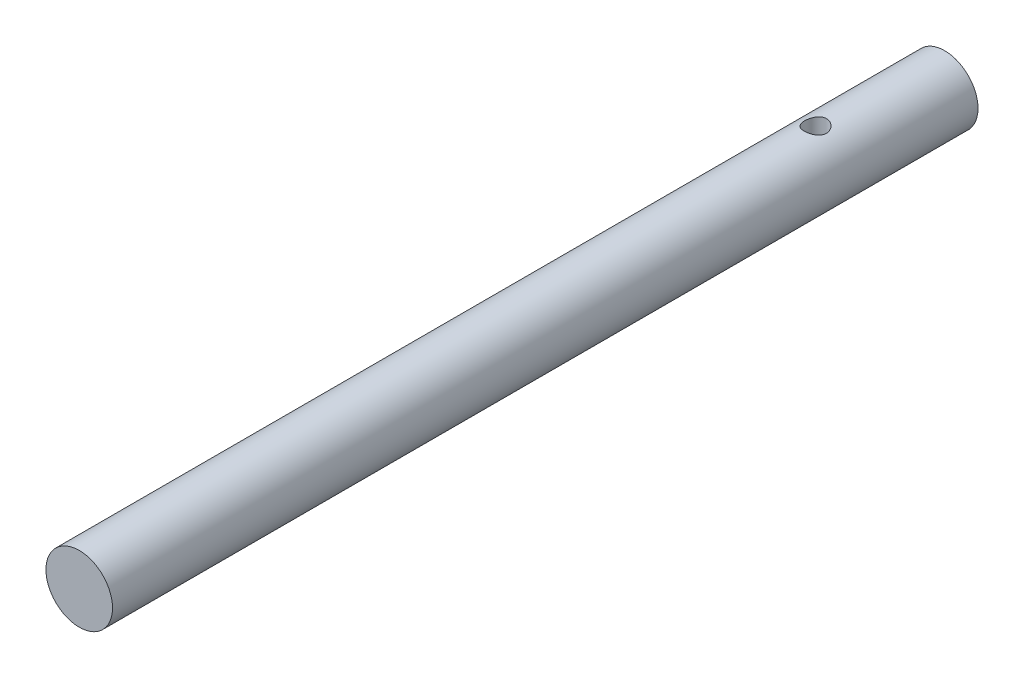
ISO-10303-21;
HEADER;
FILE_DESCRIPTION(('STEP AP214'),'2;1');
FILE_NAME('part.step','',(''),(''),'','','');
FILE_SCHEMA(('AUTOMOTIVE_DESIGN { 1 0 10303 214 1 1 1 1 }'));
ENDSEC;
DATA;
#1=APPLICATION_CONTEXT('core data for automotive mechanical design processes');
#2=APPLICATION_PROTOCOL_DEFINITION('international standard','automotive_design',2000,#1);
#3=PRODUCT_CONTEXT('',#1,'mechanical');
#4=PRODUCT('Part','Part','',(#3));
#5=PRODUCT_RELATED_PRODUCT_CATEGORY('part','',(#4));
#6=PRODUCT_DEFINITION_FORMATION('','',#4);
#7=PRODUCT_DEFINITION_CONTEXT('part definition',#1,'design');
#8=PRODUCT_DEFINITION('design','',#6,#7);
#9=PRODUCT_DEFINITION_SHAPE('','',#8);
#10=(LENGTH_UNIT() NAMED_UNIT(*) SI_UNIT(.MILLI.,.METRE.));
#11=(NAMED_UNIT(*) PLANE_ANGLE_UNIT() SI_UNIT($,.RADIAN.));
#12=(NAMED_UNIT(*) SI_UNIT($,.STERADIAN.) SOLID_ANGLE_UNIT());
#13=UNCERTAINTY_MEASURE_WITH_UNIT(LENGTH_MEASURE(1.E-05),#10,'distance_accuracy_value','');
#14=(GEOMETRIC_REPRESENTATION_CONTEXT(3) GLOBAL_UNCERTAINTY_ASSIGNED_CONTEXT((#13)) GLOBAL_UNIT_ASSIGNED_CONTEXT((#10,
#11,#12)) REPRESENTATION_CONTEXT('',''));
#15=CARTESIAN_POINT('',(0.,0.,0.));
#16=DIRECTION('',(0.,0.,1.));
#17=DIRECTION('',(1.,0.,0.));
#18=AXIS2_PLACEMENT_3D('',#15,#16,#17);
#19=CARTESIAN_POINT('',(0.,0.,130.));
#20=DIRECTION('',(0.,0.,-1.));
#21=DIRECTION('',(-1.,0.,0.));
#22=AXIS2_PLACEMENT_3D('',#19,#20,#21);
#23=CYLINDRICAL_SURFACE('',#22,5.);
#24=CARTESIAN_POINT('',(-1.69715960382936,4.70315312095298,19.3649167310371));
#25=CARTESIAN_POINT('',(-1.69715984603197,4.70315297962643,19.2749873317465));
#26=CARTESIAN_POINT('',(-1.68980901796196,4.70582509056349,19.1850590445374));
#27=CARTESIAN_POINT('',(-1.66069430554536,4.71617721664963,19.0078630576019));
#28=CARTESIAN_POINT('',(-1.63892780631591,4.7238581403518,18.9205958435767));
#29=CARTESIAN_POINT('',(-1.58182016172597,4.74328411922453,18.751317031658));
#30=CARTESIAN_POINT('',(-1.54650519132117,4.75502133353801,18.6692956533736));
#31=CARTESIAN_POINT('',(-1.46338266704602,4.78125545978098,18.51233523468));
#32=CARTESIAN_POINT('',(-1.41557244326298,4.79575296133255,18.4373977125734));
#33=CARTESIAN_POINT('',(-1.30684156370127,4.82653705632037,18.2938590916488));
#34=CARTESIAN_POINT('',(-1.24552257124465,4.84286835260061,18.2255692453036));
#35=CARTESIAN_POINT('',(-1.11234941693013,4.87517876014623,18.1000574633582));
#36=CARTESIAN_POINT('',(-1.04049360401515,4.89115781576539,18.0428372655711));
#37=CARTESIAN_POINT('',(-0.88600882690853,4.92151724276404,17.9396831420143));
#38=CARTESIAN_POINT('',(-0.803151771025416,4.93584642315683,17.8940744246304));
#39=CARTESIAN_POINT('',(-0.630385366806284,4.96086875329516,17.8175879961873));
#40=CARTESIAN_POINT('',(-0.540477886214641,4.97156286203815,17.7867063989805));
#41=CARTESIAN_POINT('',(-0.359414149270377,4.98786505369194,17.7416036591619));
#42=CARTESIAN_POINT('',(-0.268405421609514,4.99363437087109,17.7268495160485));
#43=CARTESIAN_POINT('',(-0.0850332261184434,5.00011773364319,17.7127267323223));
#44=CARTESIAN_POINT('',(0.00732989341670704,5.00083305684216,17.713354203191));
#45=CARTESIAN_POINT('',(0.18701876385454,4.9972787774664,17.7296367055802));
#46=CARTESIAN_POINT('',(0.274401651198524,4.99319978898323,17.7447129959743));
#47=CARTESIAN_POINT('',(0.445361651463065,4.98086361514448,17.7885093342228));
#48=CARTESIAN_POINT('',(0.528938507403767,4.97260614811631,17.8172303018613));
#49=CARTESIAN_POINT('',(0.6911855900331,4.95267966483971,17.8878441091013));
#50=CARTESIAN_POINT('',(0.769777856989786,4.94096767181081,17.9299034152945));
#51=CARTESIAN_POINT('',(0.918984384417156,4.91540499247986,18.0258634060757));
#52=CARTESIAN_POINT('',(0.98959644981253,4.90155372020417,18.0797673367604));
#53=CARTESIAN_POINT('',(1.12427876274281,4.87247010159022,18.2008119075043));
#54=CARTESIAN_POINT('',(1.18789604850819,4.85720351424252,18.2684490367714));
#55=CARTESIAN_POINT('',(1.30302212732983,4.82759522626236,18.4135433206727));
#56=CARTESIAN_POINT('',(1.35452913078509,4.81325366255253,18.4910019240782));
#57=CARTESIAN_POINT('',(1.44457227708496,4.78700841574361,18.6549511298946));
#58=CARTESIAN_POINT('',(1.48292066404181,4.77514089970047,18.7415511186985));
#59=CARTESIAN_POINT('',(1.54429715030218,4.75564880147487,18.9204643381946));
#60=CARTESIAN_POINT('',(1.56733151761798,4.74802248358368,19.0127752144954));
#61=CARTESIAN_POINT('',(1.59650049786468,4.73829225501314,19.1961068987363));
#62=CARTESIAN_POINT('',(1.60333882860128,4.73595858234986,19.2870035753863));
#63=CARTESIAN_POINT('',(1.60190995338905,4.736442393381,19.468654578925));
#64=CARTESIAN_POINT('',(1.59364542148976,4.73925896519479,19.5594089281663));
#65=CARTESIAN_POINT('',(1.56287988327531,4.74948957909978,19.7350368032738));
#66=CARTESIAN_POINT('',(1.54086409814469,4.7567467607406,19.8200055004338));
#67=CARTESIAN_POINT('',(1.48380732952674,4.77485136140456,19.9850393380538));
#68=CARTESIAN_POINT('',(1.44876406618,4.78569940880676,20.0651036173632));
#69=CARTESIAN_POINT('',(1.36541123796346,4.81015483596871,20.2208267580779));
#70=CARTESIAN_POINT('',(1.31672148518089,4.82383782061201,20.2962699000627));
#71=CARTESIAN_POINT('',(1.20790337527651,4.85222901003498,20.4381923347837));
#72=CARTESIAN_POINT('',(1.14777171101435,4.86693751044638,20.5046690263639));
#73=CARTESIAN_POINT('',(1.0144321391656,4.89650878235891,20.6299999118206));
#74=CARTESIAN_POINT('',(0.94074246222214,4.91134631074952,20.6883489699636));
#75=CARTESIAN_POINT('',(0.784255757240701,4.93874917833929,20.7919093726282));
#76=CARTESIAN_POINT('',(0.701459071080167,4.95131460278652,20.8371212100895));
#77=CARTESIAN_POINT('',(0.529550448447621,4.9726269540215,20.9127057232959));
#78=CARTESIAN_POINT('',(0.440485271136884,4.9813992591663,20.9431771897806));
#79=CARTESIAN_POINT('',(0.258160290510213,4.99416560657349,20.9886034242293));
#80=CARTESIAN_POINT('',(0.164901980015349,4.99816133561258,21.0035636695023));
#81=CARTESIAN_POINT('',(-0.0185318066022895,5.00076830480184,21.0170575488939));
#82=CARTESIAN_POINT('',(-0.108651065974492,4.99961940713623,21.0163170431263));
#83=CARTESIAN_POINT('',(-0.287373487425573,4.99253574345502,21.0002152067634));
#84=CARTESIAN_POINT('',(-0.375976767843562,4.98660135275737,20.9848550227474));
#85=CARTESIAN_POINT('',(-0.547808995900023,4.9706382927975,20.9404284251128));
#86=CARTESIAN_POINT('',(-0.631099445398036,4.9606736804081,20.9115753961179));
#87=CARTESIAN_POINT('',(-0.791657637108575,4.93759699117112,20.8411788362557));
#88=CARTESIAN_POINT('',(-0.868924294389511,4.92448434906597,20.7996330259176));
#89=CARTESIAN_POINT('',(-1.01832237696866,4.89581644840031,20.703284077112));
#90=CARTESIAN_POINT('',(-1.09016362522245,4.88018953087926,20.6480525829401));
#91=CARTESIAN_POINT('',(-1.22378796476295,4.84840893163961,20.526633080393));
#92=CARTESIAN_POINT('',(-1.28556786722795,4.83225508485665,20.4604416117393));
#93=CARTESIAN_POINT('',(-1.39972047864943,4.80046166059535,20.3159608795824));
#94=CARTESIAN_POINT('',(-1.4516444670341,4.78486520330165,20.2373064615479));
#95=CARTESIAN_POINT('',(-1.541523774703,4.75667261184913,20.0718950689129));
#96=CARTESIAN_POINT('',(-1.57948308499315,4.74407562082775,19.9851404182021));
#97=CARTESIAN_POINT('',(-1.63857249894814,4.72398227888061,19.8105734585939));
#98=CARTESIAN_POINT('',(-1.66047246198495,4.71625552720021,19.7230486891019));
#99=CARTESIAN_POINT('',(-1.68976351969068,4.70584184348825,19.5453205597444));
#100=CARTESIAN_POINT('',(-1.6971593608943,4.70315326270692,19.4551180859818));
#101=CARTESIAN_POINT('',(-1.69715960382936,4.70315312095298,19.3649167310371));
#102=B_SPLINE_CURVE_WITH_KNOTS('',3,(#24,#25,#26,#27,#28,#29,#30,#31,#32,#33,#34,#35,#36,#37,
#38,#39,#40,#41,#42,#43,#44,#45,#46,#47,#48,#49,#50,#51,#52,#53,#54,#55,#56,#57,#58,#59,#60,#61,
#62,#63,#64,#65,#66,#67,#68,#69,#70,#71,#72,#73,#74,#75,#76,#77,#78,#79,#80,#81,#82,#83,#84,#85,
#86,#87,#88,#89,#90,#91,#92,#93,#94,#95,#96,#97,#98,#99,#100,#101),.UNSPECIFIED.,.T.,.F.,(4,2,2,
2,2,2,2,2,2,2,2,2,2,2,2,2,2,2,2,2,2,2,2,2,2,2,2,2,2,2,2,2,2,2,2,2,2,2,4),(0.,0.269454302916436,
0.538957495994024,0.807942623457628,1.07698527314817,1.3553904348317,1.63383926765626,
1.91939248597707,2.20487031163409,2.48059787689522,2.75625573811558,3.02131448573183,
3.28639110342469,3.55491555402298,3.82351368748603,4.10452131305697,4.38557043856028,
4.67047751353534,4.95526790443248,5.22743703243198,5.49955797597572,5.76258081799806,
6.02564971172706,6.29693565916082,6.56830013781584,6.85241935986188,7.1365279197002,
7.4187050399578,7.70078248410446,7.96984890311454,8.23889422176275,8.50382155957888,
8.76879650315114,9.04343817678384,9.31816672608182,9.60337461850675,9.88850093710113,
10.1588585876967,10.4291277478431),.UNSPECIFIED.);
#103=CARTESIAN_POINT('',(-1.69715960382936,4.70315312095298,19.3649167310371));
#104=VERTEX_POINT('',#103);
#105=EDGE_CURVE('E11',#104,#104,#102,.T.);
#106=ORIENTED_EDGE('',*,*,#105,.T.);
#107=EDGE_LOOP('',(#106));
#108=FACE_BOUND('',#107,.T.);
#109=CARTESIAN_POINT('',(0.,0.,130.));
#110=DIRECTION('',(0.,0.,1.));
#111=DIRECTION('',(1.,0.,0.));
#112=AXIS2_PLACEMENT_3D('',#109,#110,#111);
#113=CIRCLE('',#112,5.);
#114=CARTESIAN_POINT('',(5.,0.,130.));
#115=VERTEX_POINT('',#114);
#116=EDGE_CURVE('E46',#115,#115,#113,.T.);
#117=ORIENTED_EDGE('',*,*,#116,.F.);
#118=EDGE_LOOP('',(#117));
#119=FACE_BOUND('',#118,.T.);
#120=CARTESIAN_POINT('',(0.,0.,0.));
#121=DIRECTION('',(0.,0.,1.));
#122=DIRECTION('',(1.,0.,0.));
#123=AXIS2_PLACEMENT_3D('',#120,#121,#122);
#124=CIRCLE('',#123,5.);
#125=CARTESIAN_POINT('',(5.,0.,0.));
#126=VERTEX_POINT('',#125);
#127=EDGE_CURVE('E58',#126,#126,#124,.T.);
#128=ORIENTED_EDGE('',*,*,#127,.T.);
#129=EDGE_LOOP('',(#128));
#130=FACE_BOUND('',#129,.T.);
#131=ADVANCED_FACE('F36',(#108,#119,#130),#23,.T.);
#132=CARTESIAN_POINT('',(0.,0.,130.));
#133=DIRECTION('',(0.,0.,1.));
#134=DIRECTION('',(1.,0.,0.));
#135=AXIS2_PLACEMENT_3D('',#132,#133,#134);
#136=PLANE('',#135);
#137=ORIENTED_EDGE('',*,*,#116,.T.);
#138=EDGE_LOOP('',(#137));
#139=FACE_BOUND('',#138,.T.);
#140=ADVANCED_FACE('F65',(#139),#136,.T.);
#141=CARTESIAN_POINT('',(0.,0.,0.));
#142=DIRECTION('',(0.,0.,1.));
#143=DIRECTION('',(1.,0.,0.));
#144=AXIS2_PLACEMENT_3D('',#141,#142,#143);
#145=PLANE('',#144);
#146=ORIENTED_EDGE('',*,*,#127,.F.);
#147=EDGE_LOOP('',(#146));
#148=FACE_BOUND('',#147,.T.);
#149=ADVANCED_FACE('F72',(#148),#145,.F.);
#150=CARTESIAN_POINT('',(-0.050045774679458,4.99974953577044,19.3649167310371));
#151=DIRECTION('',(-0.0100091549358917,0.999949907154088,0.));
#152=DIRECTION('',(-0.999949907154088,-0.0100091549358917,0.));
#153=AXIS2_PLACEMENT_3D('',#150,#151,#152);
#154=CYLINDRICAL_SURFACE('',#153,1.65);
#155=CARTESIAN_POINT('',(-0.0100091549358913,0.999949907154088,19.3649167310371));
#156=DIRECTION('',(-0.0100091549358917,0.999949907154088,0.));
#157=DIRECTION('',(-0.999949907154088,-0.0100091549358917,0.));
#158=AXIS2_PLACEMENT_3D('',#155,#156,#157);
#159=CIRCLE('',#158,1.65);
#160=CARTESIAN_POINT('',(-1.65992650174014,0.983434801509867,19.3649167310371));
#161=VERTEX_POINT('',#160);
#162=EDGE_CURVE('E56',#161,#161,#159,.T.);
#163=ORIENTED_EDGE('',*,*,#162,.F.);
#164=EDGE_LOOP('',(#163));
#165=FACE_BOUND('',#164,.T.);
#166=ORIENTED_EDGE('',*,*,#105,.F.);
#167=EDGE_LOOP('',(#166));
#168=FACE_BOUND('',#167,.T.);
#169=ADVANCED_FACE('F52',(#165,#168),#154,.F.);
#170=CARTESIAN_POINT('',(-0.0100091549358913,0.999949907154088,19.3649167310371));
#171=DIRECTION('',(-0.0100091549358917,0.999949907154088,0.));
#172=DIRECTION('',(-0.999949907154088,-0.0100091549358917,0.));
#173=AXIS2_PLACEMENT_3D('',#170,#171,#172);
#174=CONICAL_SURFACE('',#173,1.65,1.02974425867665);
#175=CARTESIAN_POINT('',(-8.58783351989894E-05,0.00857954880897818,19.3649167310371));
#176=VERTEX_POINT('',#175);
#177=VERTEX_LOOP('',#176);
#178=FACE_BOUND('',#177,.T.);
#179=ORIENTED_EDGE('',*,*,#162,.T.);
#180=EDGE_LOOP('',(#179));
#181=FACE_BOUND('',#180,.T.);
#182=ADVANCED_FACE('F49',(#178,#181),#174,.F.);
#183=CLOSED_SHELL('',(#131,#140,#149,#169,#182));
#184=MANIFOLD_SOLID_BREP('B2',#183);
#185=ADVANCED_BREP_SHAPE_REPRESENTATION('',(#18,#184),#14);
#186=SHAPE_DEFINITION_REPRESENTATION(#9,#185);
ENDSEC;
END-ISO-10303-21;
